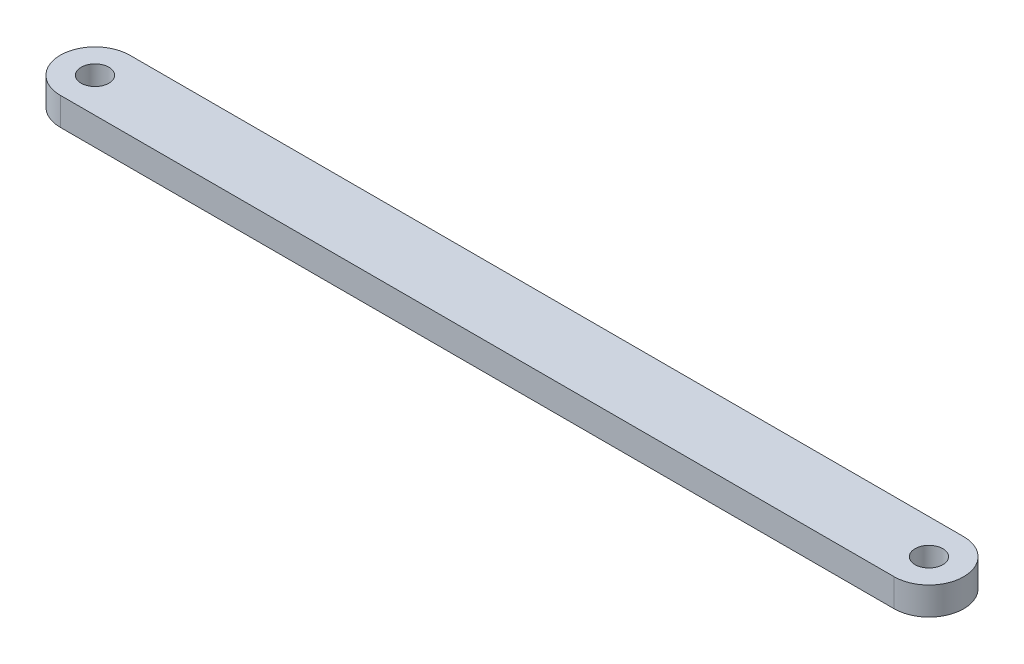
ISO-10303-21;
HEADER;
FILE_DESCRIPTION(('STEP AP214'),'2;1');
FILE_NAME('part.step','',(''),(''),'','','');
FILE_SCHEMA(('AUTOMOTIVE_DESIGN { 1 0 10303 214 1 1 1 1 }'));
ENDSEC;
DATA;
#1=APPLICATION_CONTEXT('core data for automotive mechanical design processes');
#2=APPLICATION_PROTOCOL_DEFINITION('international standard','automotive_design',2000,#1);
#3=PRODUCT_CONTEXT('',#1,'mechanical');
#4=PRODUCT('Part','Part','',(#3));
#5=PRODUCT_RELATED_PRODUCT_CATEGORY('part','',(#4));
#6=PRODUCT_DEFINITION_FORMATION('','',#4);
#7=PRODUCT_DEFINITION_CONTEXT('part definition',#1,'design');
#8=PRODUCT_DEFINITION('design','',#6,#7);
#9=PRODUCT_DEFINITION_SHAPE('','',#8);
#10=(LENGTH_UNIT() NAMED_UNIT(*) SI_UNIT(.MILLI.,.METRE.));
#11=(NAMED_UNIT(*) PLANE_ANGLE_UNIT() SI_UNIT($,.RADIAN.));
#12=(NAMED_UNIT(*) SI_UNIT($,.STERADIAN.) SOLID_ANGLE_UNIT());
#13=UNCERTAINTY_MEASURE_WITH_UNIT(LENGTH_MEASURE(1.E-05),#10,'distance_accuracy_value','');
#14=(GEOMETRIC_REPRESENTATION_CONTEXT(3) GLOBAL_UNCERTAINTY_ASSIGNED_CONTEXT((#13)) GLOBAL_UNIT_ASSIGNED_CONTEXT((#10,
#11,#12)) REPRESENTATION_CONTEXT('',''));
#15=CARTESIAN_POINT('',(0.,0.,0.));
#16=DIRECTION('',(0.,0.,1.));
#17=DIRECTION('',(1.,0.,0.));
#18=AXIS2_PLACEMENT_3D('',#15,#16,#17);
#19=CARTESIAN_POINT('',(0.,2.,0.));
#20=DIRECTION('',(0.,1.,0.));
#21=DIRECTION('',(0.,0.,1.));
#22=AXIS2_PLACEMENT_3D('',#19,#20,#21);
#23=PLANE('',#22);
#24=CARTESIAN_POINT('',(0.,2.,0.));
#25=DIRECTION('',(0.,1.,0.));
#26=DIRECTION('',(0.,0.,1.));
#27=AXIS2_PLACEMENT_3D('',#24,#25,#26);
#28=CIRCLE('',#27,1.);
#29=CARTESIAN_POINT('',(0.,2.,1.));
#30=VERTEX_POINT('',#29);
#31=EDGE_CURVE('E104',#30,#30,#28,.T.);
#32=ORIENTED_EDGE('',*,*,#31,.F.);
#33=EDGE_LOOP('',(#32));
#34=FACE_BOUND('',#33,.T.);
#35=CARTESIAN_POINT('',(0.,2.,0.));
#36=DIRECTION('',(0.,1.,0.));
#37=DIRECTION('',(0.,0.,1.));
#38=AXIS2_PLACEMENT_3D('',#35,#36,#37);
#39=CIRCLE('',#38,2.5);
#40=CARTESIAN_POINT('',(0.,2.,-2.5));
#41=VERTEX_POINT('',#40);
#42=CARTESIAN_POINT('',(0.,2.,2.5));
#43=VERTEX_POINT('',#42);
#44=EDGE_CURVE('E89',#41,#43,#39,.T.);
#45=ORIENTED_EDGE('',*,*,#44,.T.);
#46=DIRECTION('',(1.,0.,0.));
#47=VECTOR('',#46,1.);
#48=CARTESIAN_POINT('',(0.,2.,2.5));
#49=LINE('',#48,#47);
#50=CARTESIAN_POINT('',(60.,2.,2.5));
#51=VERTEX_POINT('',#50);
#52=EDGE_CURVE('E84',#43,#51,#49,.T.);
#53=ORIENTED_EDGE('',*,*,#52,.T.);
#54=CARTESIAN_POINT('',(60.,2.,0.));
#55=DIRECTION('',(0.,1.,0.));
#56=DIRECTION('',(0.,0.,1.));
#57=AXIS2_PLACEMENT_3D('',#54,#55,#56);
#58=CIRCLE('',#57,2.5);
#59=CARTESIAN_POINT('',(60.,2.,-2.5));
#60=VERTEX_POINT('',#59);
#61=EDGE_CURVE('E87',#51,#60,#58,.T.);
#62=ORIENTED_EDGE('',*,*,#61,.T.);
#63=DIRECTION('',(-1.,0.,0.));
#64=VECTOR('',#63,1.);
#65=CARTESIAN_POINT('',(0.,2.,-2.5));
#66=LINE('',#65,#64);
#67=EDGE_CURVE('E54',#60,#41,#66,.T.);
#68=ORIENTED_EDGE('',*,*,#67,.T.);
#69=EDGE_LOOP('',(#45,#53,#62,#68));
#70=FACE_BOUND('',#69,.T.);
#71=CARTESIAN_POINT('',(60.,2.,0.));
#72=DIRECTION('',(0.,1.,0.));
#73=DIRECTION('',(0.,0.,1.));
#74=AXIS2_PLACEMENT_3D('',#71,#72,#73);
#75=CIRCLE('',#74,0.999999999999998);
#76=CARTESIAN_POINT('',(60.,2.,0.999999999999998));
#77=VERTEX_POINT('',#76);
#78=EDGE_CURVE('E119',#77,#77,#75,.T.);
#79=ORIENTED_EDGE('',*,*,#78,.F.);
#80=EDGE_LOOP('',(#79));
#81=FACE_BOUND('',#80,.T.);
#82=ADVANCED_FACE('F37',(#34,#70,#81),#23,.T.);
#83=CARTESIAN_POINT('',(0.,0.,0.));
#84=DIRECTION('',(0.,1.,0.));
#85=DIRECTION('',(0.,0.,1.));
#86=AXIS2_PLACEMENT_3D('',#83,#84,#85);
#87=PLANE('',#86);
#88=CARTESIAN_POINT('',(0.,0.,0.));
#89=DIRECTION('',(0.,1.,0.));
#90=DIRECTION('',(0.,0.,1.));
#91=AXIS2_PLACEMENT_3D('',#88,#89,#90);
#92=CIRCLE('',#91,2.5);
#93=CARTESIAN_POINT('',(0.,0.,-2.5));
#94=VERTEX_POINT('',#93);
#95=CARTESIAN_POINT('',(0.,0.,2.5));
#96=VERTEX_POINT('',#95);
#97=EDGE_CURVE('E101',#94,#96,#92,.T.);
#98=ORIENTED_EDGE('',*,*,#97,.F.);
#99=DIRECTION('',(-1.,0.,0.));
#100=VECTOR('',#99,1.);
#101=CARTESIAN_POINT('',(0.,0.,-2.5));
#102=LINE('',#101,#100);
#103=CARTESIAN_POINT('',(60.,0.,-2.5));
#104=VERTEX_POINT('',#103);
#105=EDGE_CURVE('E77',#104,#94,#102,.T.);
#106=ORIENTED_EDGE('',*,*,#105,.F.);
#107=CARTESIAN_POINT('',(60.,0.,0.));
#108=DIRECTION('',(0.,1.,0.));
#109=DIRECTION('',(0.,0.,1.));
#110=AXIS2_PLACEMENT_3D('',#107,#108,#109);
#111=CIRCLE('',#110,2.5);
#112=CARTESIAN_POINT('',(60.,0.,2.5));
#113=VERTEX_POINT('',#112);
#114=EDGE_CURVE('E71',#113,#104,#111,.T.);
#115=ORIENTED_EDGE('',*,*,#114,.F.);
#116=DIRECTION('',(1.,0.,0.));
#117=VECTOR('',#116,1.);
#118=CARTESIAN_POINT('',(0.,0.,2.5));
#119=LINE('',#118,#117);
#120=EDGE_CURVE('E93',#96,#113,#119,.T.);
#121=ORIENTED_EDGE('',*,*,#120,.F.);
#122=EDGE_LOOP('',(#98,#106,#115,#121));
#123=FACE_BOUND('',#122,.T.);
#124=CARTESIAN_POINT('',(0.,0.,0.));
#125=DIRECTION('',(0.,1.,0.));
#126=DIRECTION('',(0.,0.,1.));
#127=AXIS2_PLACEMENT_3D('',#124,#125,#126);
#128=CIRCLE('',#127,1.);
#129=CARTESIAN_POINT('',(0.,0.,1.));
#130=VERTEX_POINT('',#129);
#131=EDGE_CURVE('E116',#130,#130,#128,.T.);
#132=ORIENTED_EDGE('',*,*,#131,.T.);
#133=EDGE_LOOP('',(#132));
#134=FACE_BOUND('',#133,.T.);
#135=CARTESIAN_POINT('',(60.,0.,0.));
#136=DIRECTION('',(0.,1.,0.));
#137=DIRECTION('',(0.,0.,1.));
#138=AXIS2_PLACEMENT_3D('',#135,#136,#137);
#139=CIRCLE('',#138,0.999999999999998);
#140=CARTESIAN_POINT('',(60.,0.,0.999999999999998));
#141=VERTEX_POINT('',#140);
#142=EDGE_CURVE('E122',#141,#141,#139,.T.);
#143=ORIENTED_EDGE('',*,*,#142,.T.);
#144=EDGE_LOOP('',(#143));
#145=FACE_BOUND('',#144,.T.);
#146=ADVANCED_FACE('F112',(#123,#134,#145),#87,.F.);
#147=CARTESIAN_POINT('',(0.,2.,0.));
#148=DIRECTION('',(0.,-1.,0.));
#149=DIRECTION('',(0.,0.,-1.));
#150=AXIS2_PLACEMENT_3D('',#147,#148,#149);
#151=CYLINDRICAL_SURFACE('',#150,2.5);
#152=ORIENTED_EDGE('',*,*,#97,.T.);
#153=DIRECTION('',(0.,-1.,0.));
#154=VECTOR('',#153,1.);
#155=CARTESIAN_POINT('',(0.,2.,2.5));
#156=LINE('',#155,#154);
#157=EDGE_CURVE('E11',#43,#96,#156,.T.);
#158=ORIENTED_EDGE('',*,*,#157,.F.);
#159=ORIENTED_EDGE('',*,*,#44,.F.);
#160=DIRECTION('',(0.,-1.,0.));
#161=VECTOR('',#160,1.);
#162=CARTESIAN_POINT('',(0.,2.,-2.5));
#163=LINE('',#162,#161);
#164=EDGE_CURVE('E97',#41,#94,#163,.T.);
#165=ORIENTED_EDGE('',*,*,#164,.T.);
#166=EDGE_LOOP('',(#152,#158,#159,#165));
#167=FACE_BOUND('',#166,.T.);
#168=ADVANCED_FACE('F39',(#167),#151,.T.);
#169=CARTESIAN_POINT('',(0.,2.,2.5));
#170=DIRECTION('',(0.,0.,-1.));
#171=DIRECTION('',(-1.,0.,0.));
#172=AXIS2_PLACEMENT_3D('',#169,#170,#171);
#173=PLANE('',#172);
#174=ORIENTED_EDGE('',*,*,#120,.T.);
#175=DIRECTION('',(0.,-1.,0.));
#176=VECTOR('',#175,1.);
#177=CARTESIAN_POINT('',(60.,2.,2.5));
#178=LINE('',#177,#176);
#179=EDGE_CURVE('E46',#51,#113,#178,.T.);
#180=ORIENTED_EDGE('',*,*,#179,.F.);
#181=ORIENTED_EDGE('',*,*,#52,.F.);
#182=ORIENTED_EDGE('',*,*,#157,.T.);
#183=EDGE_LOOP('',(#174,#180,#181,#182));
#184=FACE_BOUND('',#183,.T.);
#185=ADVANCED_FACE('F92',(#184),#173,.F.);
#186=CARTESIAN_POINT('',(60.,2.,0.));
#187=DIRECTION('',(0.,-1.,0.));
#188=DIRECTION('',(0.,0.,-1.));
#189=AXIS2_PLACEMENT_3D('',#186,#187,#188);
#190=CYLINDRICAL_SURFACE('',#189,2.5);
#191=ORIENTED_EDGE('',*,*,#114,.T.);
#192=DIRECTION('',(0.,-1.,0.));
#193=VECTOR('',#192,1.);
#194=CARTESIAN_POINT('',(60.,2.,-2.5));
#195=LINE('',#194,#193);
#196=EDGE_CURVE('E94',#60,#104,#195,.T.);
#197=ORIENTED_EDGE('',*,*,#196,.F.);
#198=ORIENTED_EDGE('',*,*,#61,.F.);
#199=ORIENTED_EDGE('',*,*,#179,.T.);
#200=EDGE_LOOP('',(#191,#197,#198,#199));
#201=FACE_BOUND('',#200,.T.);
#202=ADVANCED_FACE('F95',(#201),#190,.T.);
#203=CARTESIAN_POINT('',(0.,2.,-2.5));
#204=DIRECTION('',(0.,0.,1.));
#205=DIRECTION('',(1.,0.,0.));
#206=AXIS2_PLACEMENT_3D('',#203,#204,#205);
#207=PLANE('',#206);
#208=ORIENTED_EDGE('',*,*,#105,.T.);
#209=ORIENTED_EDGE('',*,*,#164,.F.);
#210=ORIENTED_EDGE('',*,*,#67,.F.);
#211=ORIENTED_EDGE('',*,*,#196,.T.);
#212=EDGE_LOOP('',(#208,#209,#210,#211));
#213=FACE_BOUND('',#212,.T.);
#214=ADVANCED_FACE('F109',(#213),#207,.F.);
#215=CARTESIAN_POINT('',(0.,2.,0.));
#216=DIRECTION('',(0.,-1.,0.));
#217=DIRECTION('',(0.,0.,-1.));
#218=AXIS2_PLACEMENT_3D('',#215,#216,#217);
#219=CYLINDRICAL_SURFACE('',#218,1.);
#220=ORIENTED_EDGE('',*,*,#31,.T.);
#221=EDGE_LOOP('',(#220));
#222=FACE_BOUND('',#221,.T.);
#223=ORIENTED_EDGE('',*,*,#131,.F.);
#224=EDGE_LOOP('',(#223));
#225=FACE_BOUND('',#224,.T.);
#226=ADVANCED_FACE('F139',(#222,#225),#219,.F.);
#227=CARTESIAN_POINT('',(60.,2.,0.));
#228=DIRECTION('',(0.,-1.,0.));
#229=DIRECTION('',(0.,0.,-1.));
#230=AXIS2_PLACEMENT_3D('',#227,#228,#229);
#231=CYLINDRICAL_SURFACE('',#230,0.999999999999998);
#232=ORIENTED_EDGE('',*,*,#78,.T.);
#233=EDGE_LOOP('',(#232));
#234=FACE_BOUND('',#233,.T.);
#235=ORIENTED_EDGE('',*,*,#142,.F.);
#236=EDGE_LOOP('',(#235));
#237=FACE_BOUND('',#236,.T.);
#238=ADVANCED_FACE('F128',(#234,#237),#231,.F.);
#239=CLOSED_SHELL('',(#82,#146,#168,#185,#202,#214,#226,#238));
#240=MANIFOLD_SOLID_BREP('B2',#239);
#241=ADVANCED_BREP_SHAPE_REPRESENTATION('',(#18,#240),#14);
#242=SHAPE_DEFINITION_REPRESENTATION(#9,#241);
ENDSEC;
END-ISO-10303-21;
